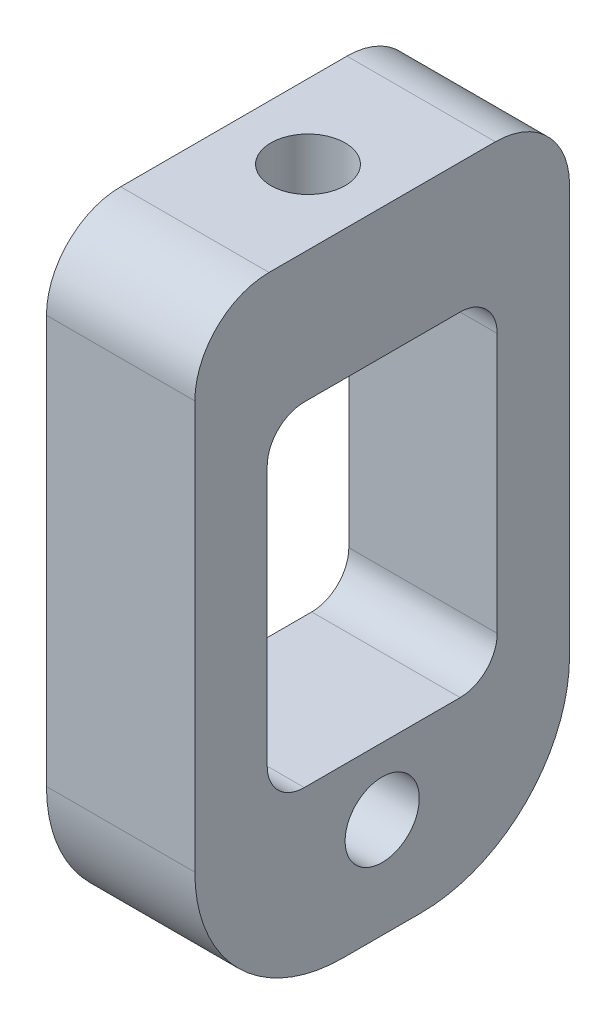
ISO-10303-21;
HEADER;
FILE_DESCRIPTION(('STEP AP214'),'2;1');
FILE_NAME('part.step','',(''),(''),'','','');
FILE_SCHEMA(('AUTOMOTIVE_DESIGN { 1 0 10303 214 1 1 1 1 }'));
ENDSEC;
DATA;
#1=APPLICATION_CONTEXT('core data for automotive mechanical design processes');
#2=APPLICATION_PROTOCOL_DEFINITION('international standard','automotive_design',2000,#1);
#3=PRODUCT_CONTEXT('',#1,'mechanical');
#4=PRODUCT('Part','Part','',(#3));
#5=PRODUCT_RELATED_PRODUCT_CATEGORY('part','',(#4));
#6=PRODUCT_DEFINITION_FORMATION('','',#4);
#7=PRODUCT_DEFINITION_CONTEXT('part definition',#1,'design');
#8=PRODUCT_DEFINITION('design','',#6,#7);
#9=PRODUCT_DEFINITION_SHAPE('','',#8);
#10=(LENGTH_UNIT() NAMED_UNIT(*) SI_UNIT(.MILLI.,.METRE.));
#11=(NAMED_UNIT(*) PLANE_ANGLE_UNIT() SI_UNIT($,.RADIAN.));
#12=(NAMED_UNIT(*) SI_UNIT($,.STERADIAN.) SOLID_ANGLE_UNIT());
#13=UNCERTAINTY_MEASURE_WITH_UNIT(LENGTH_MEASURE(1.E-05),#10,'distance_accuracy_value','');
#14=(GEOMETRIC_REPRESENTATION_CONTEXT(3) GLOBAL_UNCERTAINTY_ASSIGNED_CONTEXT((#13)) GLOBAL_UNIT_ASSIGNED_CONTEXT((#10,
#11,#12)) REPRESENTATION_CONTEXT('',''));
#15=CARTESIAN_POINT('',(0.,0.,0.));
#16=DIRECTION('',(0.,0.,1.));
#17=DIRECTION('',(1.,0.,0.));
#18=AXIS2_PLACEMENT_3D('',#15,#16,#17);
#19=CARTESIAN_POINT('',(2.,17.,5.05));
#20=DIRECTION('',(-1.,0.,0.));
#21=DIRECTION('',(0.,0.,1.));
#22=AXIS2_PLACEMENT_3D('',#19,#20,#21);
#23=PLANE('',#22);
#24=DIRECTION('',(0.,0.,-1.));
#25=VECTOR('',#24,1.);
#26=CARTESIAN_POINT('',(2.,4.5,3.1));
#27=LINE('',#26,#25);
#28=CARTESIAN_POINT('',(2.,4.5,2.1));
#29=VERTEX_POINT('',#28);
#30=CARTESIAN_POINT('',(2.,4.5,-2.1));
#31=VERTEX_POINT('',#30);
#32=EDGE_CURVE('E315',#29,#31,#27,.T.);
#33=ORIENTED_EDGE('',*,*,#32,.F.);
#34=CARTESIAN_POINT('',(2.,5.5,2.1));
#35=DIRECTION('',(-1.,0.,0.));
#36=DIRECTION('',(0.,0.,1.));
#37=AXIS2_PLACEMENT_3D('',#34,#35,#36);
#38=CIRCLE('',#37,1.);
#39=CARTESIAN_POINT('',(2.,5.5,3.1));
#40=VERTEX_POINT('',#39);
#41=EDGE_CURVE('E267',#29,#40,#38,.T.);
#42=ORIENTED_EDGE('',*,*,#41,.T.);
#43=DIRECTION('',(0.,-1.,0.));
#44=VECTOR('',#43,1.);
#45=CARTESIAN_POINT('',(2.,4.5,3.1));
#46=LINE('',#45,#44);
#47=CARTESIAN_POINT('',(2.,12.5,3.1));
#48=VERTEX_POINT('',#47);
#49=EDGE_CURVE('E303',#48,#40,#46,.T.);
#50=ORIENTED_EDGE('',*,*,#49,.F.);
#51=CARTESIAN_POINT('',(2.,12.5,2.1));
#52=DIRECTION('',(-1.,0.,0.));
#53=DIRECTION('',(0.,0.,1.));
#54=AXIS2_PLACEMENT_3D('',#51,#52,#53);
#55=CIRCLE('',#54,1.);
#56=CARTESIAN_POINT('',(2.,13.5,2.1));
#57=VERTEX_POINT('',#56);
#58=EDGE_CURVE('E11',#48,#57,#55,.T.);
#59=ORIENTED_EDGE('',*,*,#58,.T.);
#60=DIRECTION('',(0.,0.,1.));
#61=VECTOR('',#60,1.);
#62=CARTESIAN_POINT('',(2.,13.5,3.1));
#63=LINE('',#62,#61);
#64=CARTESIAN_POINT('',(2.,13.5,-2.1));
#65=VERTEX_POINT('',#64);
#66=EDGE_CURVE('E301',#65,#57,#63,.T.);
#67=ORIENTED_EDGE('',*,*,#66,.F.);
#68=CARTESIAN_POINT('',(2.,12.5,-2.1));
#69=DIRECTION('',(-1.,0.,0.));
#70=DIRECTION('',(0.,0.,1.));
#71=AXIS2_PLACEMENT_3D('',#68,#69,#70);
#72=CIRCLE('',#71,1.);
#73=CARTESIAN_POINT('',(2.,12.5,-3.1));
#74=VERTEX_POINT('',#73);
#75=EDGE_CURVE('E278',#65,#74,#72,.T.);
#76=ORIENTED_EDGE('',*,*,#75,.T.);
#77=DIRECTION('',(0.,1.,0.));
#78=VECTOR('',#77,1.);
#79=CARTESIAN_POINT('',(2.,4.5,-3.1));
#80=LINE('',#79,#78);
#81=CARTESIAN_POINT('',(2.,5.5,-3.1));
#82=VERTEX_POINT('',#81);
#83=EDGE_CURVE('E544',#82,#74,#80,.T.);
#84=ORIENTED_EDGE('',*,*,#83,.F.);
#85=CARTESIAN_POINT('',(2.,5.5,-2.1));
#86=DIRECTION('',(-1.,0.,0.));
#87=DIRECTION('',(0.,0.,1.));
#88=AXIS2_PLACEMENT_3D('',#85,#86,#87);
#89=CIRCLE('',#88,1.);
#90=EDGE_CURVE('E273',#82,#31,#89,.T.);
#91=ORIENTED_EDGE('',*,*,#90,.T.);
#92=EDGE_LOOP('',(#33,#42,#50,#59,#67,#76,#84,#91));
#93=FACE_BOUND('',#92,.T.);
#94=CARTESIAN_POINT('',(2.,2.7,0.));
#95=DIRECTION('',(-1.,0.,0.));
#96=DIRECTION('',(0.,0.,1.));
#97=AXIS2_PLACEMENT_3D('',#94,#95,#96);
#98=CIRCLE('',#97,1.);
#99=CARTESIAN_POINT('',(2.,2.7,1.));
#100=VERTEX_POINT('',#99);
#101=EDGE_CURVE('E313',#100,#100,#98,.F.);
#102=ORIENTED_EDGE('',*,*,#101,.F.);
#103=EDGE_LOOP('',(#102));
#104=FACE_BOUND('',#103,.T.);
#105=DIRECTION('',(0.,-1.,0.));
#106=VECTOR('',#105,1.);
#107=CARTESIAN_POINT('',(2.,17.,-5.05));
#108=LINE('',#107,#106);
#109=CARTESIAN_POINT('',(2.,15.,-5.05));
#110=VERTEX_POINT('',#109);
#111=CARTESIAN_POINT('',(2.,4.,-5.05));
#112=VERTEX_POINT('',#111);
#113=EDGE_CURVE('E188',#110,#112,#108,.T.);
#114=ORIENTED_EDGE('',*,*,#113,.F.);
#115=CARTESIAN_POINT('',(2.,15.,-3.05));
#116=DIRECTION('',(-1.,0.,0.));
#117=DIRECTION('',(0.,0.,1.));
#118=AXIS2_PLACEMENT_3D('',#115,#116,#117);
#119=CIRCLE('',#118,2.);
#120=CARTESIAN_POINT('',(2.,17.,-3.05));
#121=VERTEX_POINT('',#120);
#122=EDGE_CURVE('E231',#110,#121,#119,.F.);
#123=ORIENTED_EDGE('',*,*,#122,.T.);
#124=DIRECTION('',(0.,0.,-1.));
#125=VECTOR('',#124,1.);
#126=CARTESIAN_POINT('',(2.,17.,5.05));
#127=LINE('',#126,#125);
#128=CARTESIAN_POINT('',(2.,17.,3.05));
#129=VERTEX_POINT('',#128);
#130=EDGE_CURVE('E325',#129,#121,#127,.T.);
#131=ORIENTED_EDGE('',*,*,#130,.F.);
#132=CARTESIAN_POINT('',(2.,15.,3.05));
#133=DIRECTION('',(-1.,0.,0.));
#134=DIRECTION('',(0.,0.,1.));
#135=AXIS2_PLACEMENT_3D('',#132,#133,#134);
#136=CIRCLE('',#135,2.);
#137=CARTESIAN_POINT('',(2.,15.,5.05));
#138=VERTEX_POINT('',#137);
#139=EDGE_CURVE('E165',#129,#138,#136,.F.);
#140=ORIENTED_EDGE('',*,*,#139,.T.);
#141=DIRECTION('',(0.,-1.,0.));
#142=VECTOR('',#141,1.);
#143=CARTESIAN_POINT('',(2.,17.,5.05));
#144=LINE('',#143,#142);
#145=CARTESIAN_POINT('',(2.,4.,5.05));
#146=VERTEX_POINT('',#145);
#147=EDGE_CURVE('E158',#138,#146,#144,.T.);
#148=ORIENTED_EDGE('',*,*,#147,.T.);
#149=CARTESIAN_POINT('',(2.,4.,1.05));
#150=DIRECTION('',(-1.,0.,0.));
#151=DIRECTION('',(0.,0.,1.));
#152=AXIS2_PLACEMENT_3D('',#149,#150,#151);
#153=CIRCLE('',#152,4.);
#154=CARTESIAN_POINT('',(2.,0.,1.05));
#155=VERTEX_POINT('',#154);
#156=EDGE_CURVE('E162',#146,#155,#153,.F.);
#157=ORIENTED_EDGE('',*,*,#156,.T.);
#158=DIRECTION('',(0.,0.,-1.));
#159=VECTOR('',#158,1.);
#160=CARTESIAN_POINT('',(2.,0.,5.05));
#161=LINE('',#160,#159);
#162=CARTESIAN_POINT('',(2.,0.,-1.05));
#163=VERTEX_POINT('',#162);
#164=EDGE_CURVE('E324',#155,#163,#161,.T.);
#165=ORIENTED_EDGE('',*,*,#164,.T.);
#166=CARTESIAN_POINT('',(2.,4.,-1.05));
#167=DIRECTION('',(-1.,0.,0.));
#168=DIRECTION('',(0.,0.,1.));
#169=AXIS2_PLACEMENT_3D('',#166,#167,#168);
#170=CIRCLE('',#169,4.);
#171=EDGE_CURVE('E182',#163,#112,#170,.F.);
#172=ORIENTED_EDGE('',*,*,#171,.T.);
#173=EDGE_LOOP('',(#114,#123,#131,#140,#148,#157,#165,#172));
#174=FACE_BOUND('',#173,.T.);
#175=ADVANCED_FACE('F45',(#93,#104,#174),#23,.F.);
#176=CARTESIAN_POINT('',(-2.,17.,-5.05));
#177=DIRECTION('',(0.,0.,1.));
#178=DIRECTION('',(1.,0.,0.));
#179=AXIS2_PLACEMENT_3D('',#176,#177,#178);
#180=PLANE('',#179);
#181=DIRECTION('',(0.,-1.,0.));
#182=VECTOR('',#181,1.);
#183=CARTESIAN_POINT('',(-2.,17.,-5.05));
#184=LINE('',#183,#182);
#185=CARTESIAN_POINT('',(-2.,15.,-5.05));
#186=VERTEX_POINT('',#185);
#187=CARTESIAN_POINT('',(-2.,4.,-5.05));
#188=VERTEX_POINT('',#187);
#189=EDGE_CURVE('E194',#186,#188,#184,.T.);
#190=ORIENTED_EDGE('',*,*,#189,.F.);
#191=DIRECTION('',(-1.,0.,0.));
#192=VECTOR('',#191,1.);
#193=CARTESIAN_POINT('',(-2.,15.,-5.05));
#194=LINE('',#193,#192);
#195=EDGE_CURVE('E226',#186,#110,#194,.F.);
#196=ORIENTED_EDGE('',*,*,#195,.T.);
#197=ORIENTED_EDGE('',*,*,#113,.T.);
#198=DIRECTION('',(-1.,0.,0.));
#199=VECTOR('',#198,1.);
#200=CARTESIAN_POINT('',(-2.,4.,-5.05));
#201=LINE('',#200,#199);
#202=EDGE_CURVE('E208',#112,#188,#201,.T.);
#203=ORIENTED_EDGE('',*,*,#202,.T.);
#204=EDGE_LOOP('',(#190,#196,#197,#203));
#205=FACE_BOUND('',#204,.T.);
#206=ADVANCED_FACE('F352',(#205),#180,.F.);
#207=CARTESIAN_POINT('',(-2.,17.,5.05));
#208=DIRECTION('',(1.,0.,0.));
#209=DIRECTION('',(0.,0.,-1.));
#210=AXIS2_PLACEMENT_3D('',#207,#208,#209);
#211=PLANE('',#210);
#212=DIRECTION('',(0.,0.,-1.));
#213=VECTOR('',#212,1.);
#214=CARTESIAN_POINT('',(-2.,13.5,3.1));
#215=LINE('',#214,#213);
#216=CARTESIAN_POINT('',(-2.,13.5,2.1));
#217=VERTEX_POINT('',#216);
#218=CARTESIAN_POINT('',(-2.,13.5,-2.1));
#219=VERTEX_POINT('',#218);
#220=EDGE_CURVE('E286',#217,#219,#215,.T.);
#221=ORIENTED_EDGE('',*,*,#220,.F.);
#222=CARTESIAN_POINT('',(-2.,12.5,2.1));
#223=DIRECTION('',(1.,0.,0.));
#224=DIRECTION('',(0.,0.,-1.));
#225=AXIS2_PLACEMENT_3D('',#222,#223,#224);
#226=CIRCLE('',#225,1.);
#227=CARTESIAN_POINT('',(-2.,12.5,3.1));
#228=VERTEX_POINT('',#227);
#229=EDGE_CURVE('E54',#217,#228,#226,.T.);
#230=ORIENTED_EDGE('',*,*,#229,.T.);
#231=DIRECTION('',(0.,1.,0.));
#232=VECTOR('',#231,1.);
#233=CARTESIAN_POINT('',(-2.,4.5,3.1));
#234=LINE('',#233,#232);
#235=CARTESIAN_POINT('',(-2.,5.5,3.1));
#236=VERTEX_POINT('',#235);
#237=EDGE_CURVE('E285',#236,#228,#234,.T.);
#238=ORIENTED_EDGE('',*,*,#237,.F.);
#239=CARTESIAN_POINT('',(-2.,5.5,2.1));
#240=DIRECTION('',(1.,0.,0.));
#241=DIRECTION('',(0.,0.,-1.));
#242=AXIS2_PLACEMENT_3D('',#239,#240,#241);
#243=CIRCLE('',#242,1.);
#244=CARTESIAN_POINT('',(-2.,4.5,2.1));
#245=VERTEX_POINT('',#244);
#246=EDGE_CURVE('E264',#236,#245,#243,.T.);
#247=ORIENTED_EDGE('',*,*,#246,.T.);
#248=DIRECTION('',(0.,0.,1.));
#249=VECTOR('',#248,1.);
#250=CARTESIAN_POINT('',(-2.,4.5,3.1));
#251=LINE('',#250,#249);
#252=CARTESIAN_POINT('',(-2.,4.5,-2.1));
#253=VERTEX_POINT('',#252);
#254=EDGE_CURVE('E318',#253,#245,#251,.T.);
#255=ORIENTED_EDGE('',*,*,#254,.F.);
#256=CARTESIAN_POINT('',(-2.,5.5,-2.1));
#257=DIRECTION('',(1.,0.,0.));
#258=DIRECTION('',(0.,0.,-1.));
#259=AXIS2_PLACEMENT_3D('',#256,#257,#258);
#260=CIRCLE('',#259,1.);
#261=CARTESIAN_POINT('',(-2.,5.5,-3.1));
#262=VERTEX_POINT('',#261);
#263=EDGE_CURVE('E270',#253,#262,#260,.T.);
#264=ORIENTED_EDGE('',*,*,#263,.T.);
#265=DIRECTION('',(0.,-1.,0.));
#266=VECTOR('',#265,1.);
#267=CARTESIAN_POINT('',(-2.,4.5,-3.1));
#268=LINE('',#267,#266);
#269=CARTESIAN_POINT('',(-2.,12.5,-3.1));
#270=VERTEX_POINT('',#269);
#271=EDGE_CURVE('E555',#270,#262,#268,.T.);
#272=ORIENTED_EDGE('',*,*,#271,.F.);
#273=CARTESIAN_POINT('',(-2.,12.5,-2.1));
#274=DIRECTION('',(1.,0.,0.));
#275=DIRECTION('',(0.,0.,-1.));
#276=AXIS2_PLACEMENT_3D('',#273,#274,#275);
#277=CIRCLE('',#276,1.);
#278=EDGE_CURVE('E61',#270,#219,#277,.T.);
#279=ORIENTED_EDGE('',*,*,#278,.T.);
#280=EDGE_LOOP('',(#221,#230,#238,#247,#255,#264,#272,#279));
#281=FACE_BOUND('',#280,.T.);
#282=CARTESIAN_POINT('',(-2.,2.7,0.));
#283=DIRECTION('',(-1.,0.,0.));
#284=DIRECTION('',(0.,0.,1.));
#285=AXIS2_PLACEMENT_3D('',#282,#283,#284);
#286=CIRCLE('',#285,1.);
#287=CARTESIAN_POINT('',(-2.,2.7,1.));
#288=VERTEX_POINT('',#287);
#289=EDGE_CURVE('E308',#288,#288,#286,.T.);
#290=ORIENTED_EDGE('',*,*,#289,.F.);
#291=EDGE_LOOP('',(#290));
#292=FACE_BOUND('',#291,.T.);
#293=DIRECTION('',(0.,0.,1.));
#294=VECTOR('',#293,1.);
#295=CARTESIAN_POINT('',(-2.,17.,5.05));
#296=LINE('',#295,#294);
#297=CARTESIAN_POINT('',(-2.,17.,-3.05));
#298=VERTEX_POINT('',#297);
#299=CARTESIAN_POINT('',(-2.,17.,3.05));
#300=VERTEX_POINT('',#299);
#301=EDGE_CURVE('E171',#298,#300,#296,.T.);
#302=ORIENTED_EDGE('',*,*,#301,.F.);
#303=CARTESIAN_POINT('',(-2.,15.,-3.05));
#304=DIRECTION('',(1.,0.,0.));
#305=DIRECTION('',(0.,0.,-1.));
#306=AXIS2_PLACEMENT_3D('',#303,#304,#305);
#307=CIRCLE('',#306,2.);
#308=EDGE_CURVE('E223',#298,#186,#307,.F.);
#309=ORIENTED_EDGE('',*,*,#308,.T.);
#310=ORIENTED_EDGE('',*,*,#189,.T.);
#311=CARTESIAN_POINT('',(-2.,4.,-1.05));
#312=DIRECTION('',(1.,0.,0.));
#313=DIRECTION('',(0.,0.,-1.));
#314=AXIS2_PLACEMENT_3D('',#311,#312,#313);
#315=CIRCLE('',#314,4.);
#316=CARTESIAN_POINT('',(-2.,0.,-1.05));
#317=VERTEX_POINT('',#316);
#318=EDGE_CURVE('E202',#188,#317,#315,.F.);
#319=ORIENTED_EDGE('',*,*,#318,.T.);
#320=DIRECTION('',(0.,0.,1.));
#321=VECTOR('',#320,1.);
#322=CARTESIAN_POINT('',(-2.,0.,5.05));
#323=LINE('',#322,#321);
#324=CARTESIAN_POINT('',(-2.,0.,1.05));
#325=VERTEX_POINT('',#324);
#326=EDGE_CURVE('E329',#317,#325,#323,.T.);
#327=ORIENTED_EDGE('',*,*,#326,.T.);
#328=CARTESIAN_POINT('',(-2.,4.,1.05));
#329=DIRECTION('',(1.,0.,0.));
#330=DIRECTION('',(0.,0.,-1.));
#331=AXIS2_PLACEMENT_3D('',#328,#329,#330);
#332=CIRCLE('',#331,4.);
#333=CARTESIAN_POINT('',(-2.,4.,5.05));
#334=VERTEX_POINT('',#333);
#335=EDGE_CURVE('E205',#325,#334,#332,.F.);
#336=ORIENTED_EDGE('',*,*,#335,.T.);
#337=DIRECTION('',(0.,-1.,0.));
#338=VECTOR('',#337,1.);
#339=CARTESIAN_POINT('',(-2.,17.,5.05));
#340=LINE('',#339,#338);
#341=CARTESIAN_POINT('',(-2.,15.,5.05));
#342=VERTEX_POINT('',#341);
#343=EDGE_CURVE('E170',#342,#334,#340,.T.);
#344=ORIENTED_EDGE('',*,*,#343,.F.);
#345=CARTESIAN_POINT('',(-2.,15.,3.05));
#346=DIRECTION('',(1.,0.,0.));
#347=DIRECTION('',(0.,0.,-1.));
#348=AXIS2_PLACEMENT_3D('',#345,#346,#347);
#349=CIRCLE('',#348,2.);
#350=EDGE_CURVE('E220',#342,#300,#349,.F.);
#351=ORIENTED_EDGE('',*,*,#350,.T.);
#352=EDGE_LOOP('',(#302,#309,#310,#319,#327,#336,#344,#351));
#353=FACE_BOUND('',#352,.T.);
#354=ADVANCED_FACE('F283',(#281,#292,#353),#211,.F.);
#355=CARTESIAN_POINT('',(-2.,17.,5.05));
#356=DIRECTION('',(0.,0.,-1.));
#357=DIRECTION('',(-1.,0.,0.));
#358=AXIS2_PLACEMENT_3D('',#355,#356,#357);
#359=PLANE('',#358);
#360=ORIENTED_EDGE('',*,*,#147,.F.);
#361=DIRECTION('',(1.,0.,0.));
#362=VECTOR('',#361,1.);
#363=CARTESIAN_POINT('',(-2.,15.,5.05));
#364=LINE('',#363,#362);
#365=EDGE_CURVE('E234',#138,#342,#364,.F.);
#366=ORIENTED_EDGE('',*,*,#365,.T.);
#367=ORIENTED_EDGE('',*,*,#343,.T.);
#368=DIRECTION('',(1.,0.,0.));
#369=VECTOR('',#368,1.);
#370=CARTESIAN_POINT('',(2.,4.,5.05));
#371=LINE('',#370,#369);
#372=EDGE_CURVE('E178',#334,#146,#371,.T.);
#373=ORIENTED_EDGE('',*,*,#372,.T.);
#374=EDGE_LOOP('',(#360,#366,#367,#373));
#375=FACE_BOUND('',#374,.T.);
#376=ADVANCED_FACE('F184',(#375),#359,.F.);
#377=CARTESIAN_POINT('',(0.,17.,0.));
#378=DIRECTION('',(0.,-1.,0.));
#379=DIRECTION('',(0.,0.,-1.));
#380=AXIS2_PLACEMENT_3D('',#377,#378,#379);
#381=PLANE('',#380);
#382=CARTESIAN_POINT('',(0.,17.,0.));
#383=DIRECTION('',(0.,1.,0.));
#384=DIRECTION('',(0.,0.,1.));
#385=AXIS2_PLACEMENT_3D('',#382,#383,#384);
#386=CIRCLE('',#385,1.);
#387=CARTESIAN_POINT('',(0.,17.,1.));
#388=VERTEX_POINT('',#387);
#389=EDGE_CURVE('E567',#388,#388,#386,.T.);
#390=ORIENTED_EDGE('',*,*,#389,.F.);
#391=EDGE_LOOP('',(#390));
#392=FACE_BOUND('',#391,.T.);
#393=ORIENTED_EDGE('',*,*,#130,.T.);
#394=DIRECTION('',(-1.,0.,0.));
#395=VECTOR('',#394,1.);
#396=CARTESIAN_POINT('',(0.,17.,-3.05));
#397=LINE('',#396,#395);
#398=EDGE_CURVE('E216',#121,#298,#397,.T.);
#399=ORIENTED_EDGE('',*,*,#398,.T.);
#400=ORIENTED_EDGE('',*,*,#301,.T.);
#401=DIRECTION('',(1.,0.,0.));
#402=VECTOR('',#401,1.);
#403=CARTESIAN_POINT('',(0.,17.,3.05));
#404=LINE('',#403,#402);
#405=EDGE_CURVE('E212',#300,#129,#404,.T.);
#406=ORIENTED_EDGE('',*,*,#405,.T.);
#407=EDGE_LOOP('',(#393,#399,#400,#406));
#408=FACE_BOUND('',#407,.T.);
#409=ADVANCED_FACE('F361',(#392,#408),#381,.F.);
#410=CARTESIAN_POINT('',(0.,0.,0.));
#411=DIRECTION('',(0.,-1.,0.));
#412=DIRECTION('',(0.,0.,-1.));
#413=AXIS2_PLACEMENT_3D('',#410,#411,#412);
#414=PLANE('',#413);
#415=ORIENTED_EDGE('',*,*,#164,.F.);
#416=DIRECTION('',(1.,0.,0.));
#417=VECTOR('',#416,1.);
#418=CARTESIAN_POINT('',(-2.,0.,1.05));
#419=LINE('',#418,#417);
#420=EDGE_CURVE('E179',#155,#325,#419,.F.);
#421=ORIENTED_EDGE('',*,*,#420,.T.);
#422=ORIENTED_EDGE('',*,*,#326,.F.);
#423=DIRECTION('',(-1.,0.,0.));
#424=VECTOR('',#423,1.);
#425=CARTESIAN_POINT('',(2.,0.,-1.05));
#426=LINE('',#425,#424);
#427=EDGE_CURVE('E181',#317,#163,#426,.F.);
#428=ORIENTED_EDGE('',*,*,#427,.T.);
#429=EDGE_LOOP('',(#415,#421,#422,#428));
#430=FACE_BOUND('',#429,.T.);
#431=ADVANCED_FACE('F355',(#430),#414,.T.);
#432=CARTESIAN_POINT('',(4.82842712474619,2.7,0.));
#433=DIRECTION('',(-1.,0.,0.));
#434=DIRECTION('',(0.,0.,1.));
#435=AXIS2_PLACEMENT_3D('',#432,#433,#434);
#436=CYLINDRICAL_SURFACE('',#435,1.);
#437=ORIENTED_EDGE('',*,*,#101,.T.);
#438=EDGE_LOOP('',(#437));
#439=FACE_BOUND('',#438,.T.);
#440=ORIENTED_EDGE('',*,*,#289,.T.);
#441=EDGE_LOOP('',(#440));
#442=FACE_BOUND('',#441,.T.);
#443=ADVANCED_FACE('F411',(#439,#442),#436,.F.);
#444=CARTESIAN_POINT('',(12.9288608738514,4.5,3.1));
#445=DIRECTION('',(0.,0.,1.));
#446=DIRECTION('',(0.,-1.,0.));
#447=AXIS2_PLACEMENT_3D('',#444,#445,#446);
#448=PLANE('',#447);
#449=ORIENTED_EDGE('',*,*,#49,.T.);
#450=DIRECTION('',(-1.,0.,0.));
#451=VECTOR('',#450,1.);
#452=CARTESIAN_POINT('',(-2.,5.5,3.1));
#453=LINE('',#452,#451);
#454=EDGE_CURVE('E240',#40,#236,#453,.T.);
#455=ORIENTED_EDGE('',*,*,#454,.T.);
#456=ORIENTED_EDGE('',*,*,#237,.T.);
#457=DIRECTION('',(-1.,0.,0.));
#458=VECTOR('',#457,1.);
#459=CARTESIAN_POINT('',(2.,12.5,3.1));
#460=LINE('',#459,#458);
#461=EDGE_CURVE('E237',#228,#48,#460,.F.);
#462=ORIENTED_EDGE('',*,*,#461,.T.);
#463=EDGE_LOOP('',(#449,#455,#456,#462));
#464=FACE_BOUND('',#463,.T.);
#465=ADVANCED_FACE('F289',(#464),#448,.F.);
#466=CARTESIAN_POINT('',(12.9288608738514,4.5,3.1));
#467=DIRECTION('',(0.,-1.,0.));
#468=DIRECTION('',(0.,0.,-1.));
#469=AXIS2_PLACEMENT_3D('',#466,#467,#468);
#470=PLANE('',#469);
#471=ORIENTED_EDGE('',*,*,#254,.T.);
#472=DIRECTION('',(-1.,0.,0.));
#473=VECTOR('',#472,1.);
#474=CARTESIAN_POINT('',(2.,4.5,2.1));
#475=LINE('',#474,#473);
#476=EDGE_CURVE('E248',#245,#29,#475,.F.);
#477=ORIENTED_EDGE('',*,*,#476,.T.);
#478=ORIENTED_EDGE('',*,*,#32,.T.);
#479=DIRECTION('',(-1.,0.,0.));
#480=VECTOR('',#479,1.);
#481=CARTESIAN_POINT('',(-2.,4.5,-2.1));
#482=LINE('',#481,#480);
#483=EDGE_CURVE('E244',#31,#253,#482,.T.);
#484=ORIENTED_EDGE('',*,*,#483,.T.);
#485=EDGE_LOOP('',(#471,#477,#478,#484));
#486=FACE_BOUND('',#485,.T.);
#487=ADVANCED_FACE('F402',(#486),#470,.F.);
#488=CARTESIAN_POINT('',(12.9288608738514,4.5,-3.1));
#489=DIRECTION('',(0.,0.,-1.));
#490=DIRECTION('',(0.,1.,0.));
#491=AXIS2_PLACEMENT_3D('',#488,#489,#490);
#492=PLANE('',#491);
#493=ORIENTED_EDGE('',*,*,#271,.T.);
#494=DIRECTION('',(-1.,0.,0.));
#495=VECTOR('',#494,1.);
#496=CARTESIAN_POINT('',(2.,5.5,-3.1));
#497=LINE('',#496,#495);
#498=EDGE_CURVE('E255',#262,#82,#497,.F.);
#499=ORIENTED_EDGE('',*,*,#498,.T.);
#500=ORIENTED_EDGE('',*,*,#83,.T.);
#501=DIRECTION('',(-1.,0.,0.));
#502=VECTOR('',#501,1.);
#503=CARTESIAN_POINT('',(-2.,12.5,-3.1));
#504=LINE('',#503,#502);
#505=EDGE_CURVE('E251',#74,#270,#504,.T.);
#506=ORIENTED_EDGE('',*,*,#505,.T.);
#507=EDGE_LOOP('',(#493,#499,#500,#506));
#508=FACE_BOUND('',#507,.T.);
#509=ADVANCED_FACE('F396',(#508),#492,.F.);
#510=CARTESIAN_POINT('',(12.9288608738514,13.5,3.1));
#511=DIRECTION('',(0.,1.,0.));
#512=DIRECTION('',(0.,0.,1.));
#513=AXIS2_PLACEMENT_3D('',#510,#511,#512);
#514=PLANE('',#513);
#515=CARTESIAN_POINT('',(0.,13.5,0.));
#516=DIRECTION('',(0.,1.,0.));
#517=DIRECTION('',(0.,0.,1.));
#518=AXIS2_PLACEMENT_3D('',#515,#516,#517);
#519=CIRCLE('',#518,1.);
#520=CARTESIAN_POINT('',(0.,13.5,1.));
#521=VERTEX_POINT('',#520);
#522=EDGE_CURVE('E293',#521,#521,#519,.F.);
#523=ORIENTED_EDGE('',*,*,#522,.F.);
#524=EDGE_LOOP('',(#523));
#525=FACE_BOUND('',#524,.T.);
#526=ORIENTED_EDGE('',*,*,#220,.T.);
#527=DIRECTION('',(-1.,0.,0.));
#528=VECTOR('',#527,1.);
#529=CARTESIAN_POINT('',(2.,13.5,-2.1));
#530=LINE('',#529,#528);
#531=EDGE_CURVE('E261',#219,#65,#530,.F.);
#532=ORIENTED_EDGE('',*,*,#531,.T.);
#533=ORIENTED_EDGE('',*,*,#66,.T.);
#534=DIRECTION('',(-1.,0.,0.));
#535=VECTOR('',#534,1.);
#536=CARTESIAN_POINT('',(-2.,13.5,2.1));
#537=LINE('',#536,#535);
#538=EDGE_CURVE('E258',#57,#217,#537,.T.);
#539=ORIENTED_EDGE('',*,*,#538,.T.);
#540=EDGE_LOOP('',(#526,#532,#533,#539));
#541=FACE_BOUND('',#540,.T.);
#542=ADVANCED_FACE('F305',(#525,#541),#514,.F.);
#543=CARTESIAN_POINT('',(0.,10.6715728752538,0.));
#544=DIRECTION('',(0.,1.,0.));
#545=DIRECTION('',(0.,0.,1.));
#546=AXIS2_PLACEMENT_3D('',#543,#544,#545);
#547=CYLINDRICAL_SURFACE('',#546,1.);
#548=ORIENTED_EDGE('',*,*,#522,.T.);
#549=EDGE_LOOP('',(#548));
#550=FACE_BOUND('',#549,.T.);
#551=ORIENTED_EDGE('',*,*,#389,.T.);
#552=EDGE_LOOP('',(#551));
#553=FACE_BOUND('',#552,.T.);
#554=ADVANCED_FACE('F385',(#550,#553),#547,.F.);
#555=CARTESIAN_POINT('',(-2.,4.,1.05));
#556=DIRECTION('',(-1.,0.,0.));
#557=DIRECTION('',(0.,0.,1.));
#558=AXIS2_PLACEMENT_3D('',#555,#556,#557);
#559=CYLINDRICAL_SURFACE('',#558,4.);
#560=ORIENTED_EDGE('',*,*,#335,.F.);
#561=ORIENTED_EDGE('',*,*,#420,.F.);
#562=ORIENTED_EDGE('',*,*,#156,.F.);
#563=ORIENTED_EDGE('',*,*,#372,.F.);
#564=EDGE_LOOP('',(#560,#561,#562,#563));
#565=FACE_BOUND('',#564,.T.);
#566=ADVANCED_FACE('F177',(#565),#559,.T.);
#567=CARTESIAN_POINT('',(-2.,4.,-1.05));
#568=DIRECTION('',(1.,0.,0.));
#569=DIRECTION('',(0.,0.,-1.));
#570=AXIS2_PLACEMENT_3D('',#567,#568,#569);
#571=CYLINDRICAL_SURFACE('',#570,4.);
#572=ORIENTED_EDGE('',*,*,#171,.F.);
#573=ORIENTED_EDGE('',*,*,#427,.F.);
#574=ORIENTED_EDGE('',*,*,#318,.F.);
#575=ORIENTED_EDGE('',*,*,#202,.F.);
#576=EDGE_LOOP('',(#572,#573,#574,#575));
#577=FACE_BOUND('',#576,.T.);
#578=ADVANCED_FACE('F351',(#577),#571,.T.);
#579=CARTESIAN_POINT('',(0.,15.,-3.05));
#580=DIRECTION('',(-1.,0.,0.));
#581=DIRECTION('',(0.,0.,1.));
#582=AXIS2_PLACEMENT_3D('',#579,#580,#581);
#583=CYLINDRICAL_SURFACE('',#582,2.);
#584=ORIENTED_EDGE('',*,*,#122,.F.);
#585=ORIENTED_EDGE('',*,*,#195,.F.);
#586=ORIENTED_EDGE('',*,*,#308,.F.);
#587=ORIENTED_EDGE('',*,*,#398,.F.);
#588=EDGE_LOOP('',(#584,#585,#586,#587));
#589=FACE_BOUND('',#588,.T.);
#590=ADVANCED_FACE('F364',(#589),#583,.T.);
#591=CARTESIAN_POINT('',(0.,15.,3.05));
#592=DIRECTION('',(1.,0.,0.));
#593=DIRECTION('',(0.,0.,-1.));
#594=AXIS2_PLACEMENT_3D('',#591,#592,#593);
#595=CYLINDRICAL_SURFACE('',#594,2.);
#596=ORIENTED_EDGE('',*,*,#350,.F.);
#597=ORIENTED_EDGE('',*,*,#365,.F.);
#598=ORIENTED_EDGE('',*,*,#139,.F.);
#599=ORIENTED_EDGE('',*,*,#405,.F.);
#600=EDGE_LOOP('',(#596,#597,#598,#599));
#601=FACE_BOUND('',#600,.T.);
#602=ADVANCED_FACE('F359',(#601),#595,.T.);
#603=CARTESIAN_POINT('',(12.9288608738514,5.5,2.1));
#604=DIRECTION('',(1.,0.,0.));
#605=DIRECTION('',(0.,0.,-1.));
#606=AXIS2_PLACEMENT_3D('',#603,#604,#605);
#607=CYLINDRICAL_SURFACE('',#606,1.);
#608=ORIENTED_EDGE('',*,*,#41,.F.);
#609=ORIENTED_EDGE('',*,*,#476,.F.);
#610=ORIENTED_EDGE('',*,*,#246,.F.);
#611=ORIENTED_EDGE('',*,*,#454,.F.);
#612=EDGE_LOOP('',(#608,#609,#610,#611));
#613=FACE_BOUND('',#612,.T.);
#614=ADVANCED_FACE('F371',(#613),#607,.F.);
#615=CARTESIAN_POINT('',(12.9288608738514,5.5,-2.1));
#616=DIRECTION('',(1.,0.,0.));
#617=DIRECTION('',(0.,0.,-1.));
#618=AXIS2_PLACEMENT_3D('',#615,#616,#617);
#619=CYLINDRICAL_SURFACE('',#618,1.);
#620=ORIENTED_EDGE('',*,*,#90,.F.);
#621=ORIENTED_EDGE('',*,*,#498,.F.);
#622=ORIENTED_EDGE('',*,*,#263,.F.);
#623=ORIENTED_EDGE('',*,*,#483,.F.);
#624=EDGE_LOOP('',(#620,#621,#622,#623));
#625=FACE_BOUND('',#624,.T.);
#626=ADVANCED_FACE('F450',(#625),#619,.F.);
#627=CARTESIAN_POINT('',(12.9288608738514,12.5,-2.1));
#628=DIRECTION('',(1.,0.,0.));
#629=DIRECTION('',(0.,0.,-1.));
#630=AXIS2_PLACEMENT_3D('',#627,#628,#629);
#631=CYLINDRICAL_SURFACE('',#630,1.);
#632=ORIENTED_EDGE('',*,*,#75,.F.);
#633=ORIENTED_EDGE('',*,*,#531,.F.);
#634=ORIENTED_EDGE('',*,*,#278,.F.);
#635=ORIENTED_EDGE('',*,*,#505,.F.);
#636=EDGE_LOOP('',(#632,#633,#634,#635));
#637=FACE_BOUND('',#636,.T.);
#638=ADVANCED_FACE('F460',(#637),#631,.F.);
#639=CARTESIAN_POINT('',(12.9288608738514,12.5,2.1));
#640=DIRECTION('',(1.,0.,0.));
#641=DIRECTION('',(0.,0.,-1.));
#642=AXIS2_PLACEMENT_3D('',#639,#640,#641);
#643=CYLINDRICAL_SURFACE('',#642,1.);
#644=ORIENTED_EDGE('',*,*,#58,.F.);
#645=ORIENTED_EDGE('',*,*,#461,.F.);
#646=ORIENTED_EDGE('',*,*,#229,.F.);
#647=ORIENTED_EDGE('',*,*,#538,.F.);
#648=EDGE_LOOP('',(#644,#645,#646,#647));
#649=FACE_BOUND('',#648,.T.);
#650=ADVANCED_FACE('F47',(#649),#643,.F.);
#651=CLOSED_SHELL('',(#175,#206,#354,#376,#409,#431,#443,#465,#487,#509,#542,#554,#566,#578,
#590,#602,#614,#626,#638,#650));
#652=MANIFOLD_SOLID_BREP('B2',#651);
#653=ADVANCED_BREP_SHAPE_REPRESENTATION('',(#18,#652),#14);
#654=SHAPE_DEFINITION_REPRESENTATION(#9,#653);
ENDSEC;
END-ISO-10303-21;
